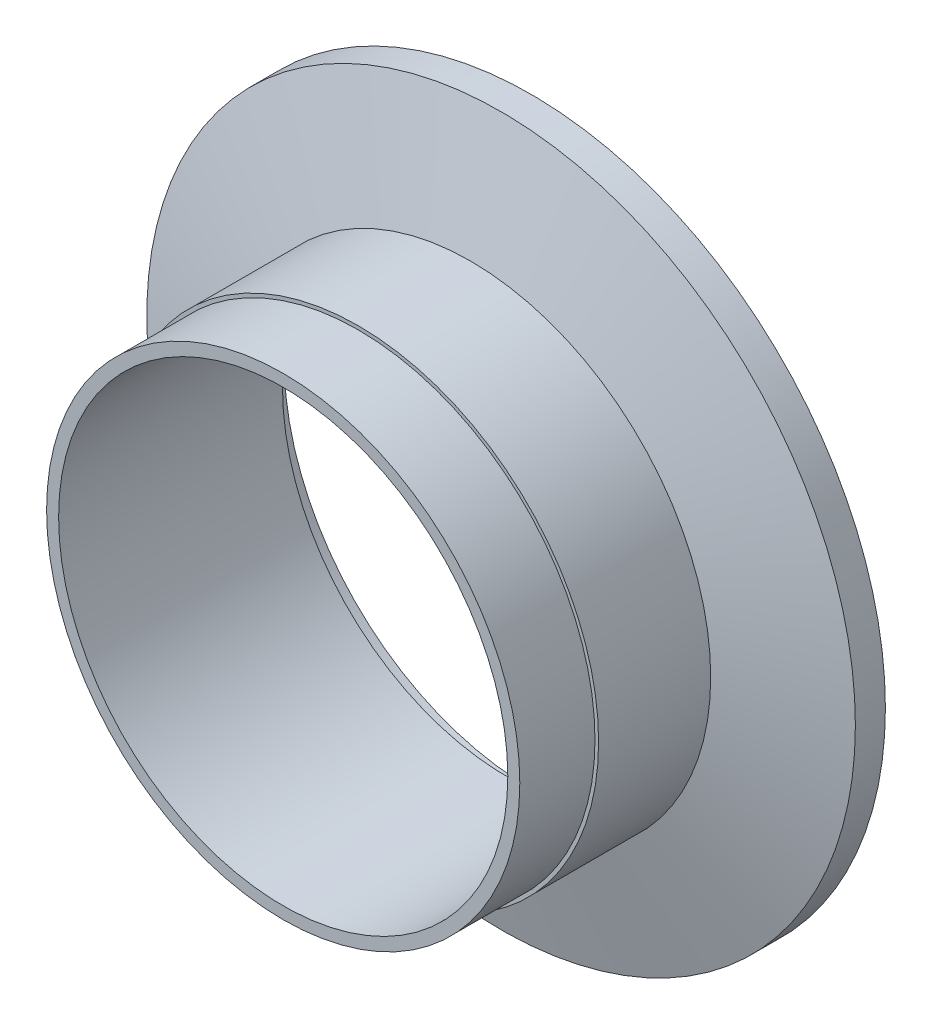
ISO-10303-21;
HEADER;
FILE_DESCRIPTION(('STEP AP214'),'2;1');
FILE_NAME('part.step','',(''),(''),'','','');
FILE_SCHEMA(('AUTOMOTIVE_DESIGN { 1 0 10303 214 1 1 1 1 }'));
ENDSEC;
DATA;
#1=APPLICATION_CONTEXT('core data for automotive mechanical design processes');
#2=APPLICATION_PROTOCOL_DEFINITION('international standard','automotive_design',2000,#1);
#3=PRODUCT_CONTEXT('',#1,'mechanical');
#4=PRODUCT('Part','Part','',(#3));
#5=PRODUCT_RELATED_PRODUCT_CATEGORY('part','',(#4));
#6=PRODUCT_DEFINITION_FORMATION('','',#4);
#7=PRODUCT_DEFINITION_CONTEXT('part definition',#1,'design');
#8=PRODUCT_DEFINITION('design','',#6,#7);
#9=PRODUCT_DEFINITION_SHAPE('','',#8);
#10=(LENGTH_UNIT() NAMED_UNIT(*) SI_UNIT(.MILLI.,.METRE.));
#11=(NAMED_UNIT(*) PLANE_ANGLE_UNIT() SI_UNIT($,.RADIAN.));
#12=(NAMED_UNIT(*) SI_UNIT($,.STERADIAN.) SOLID_ANGLE_UNIT());
#13=UNCERTAINTY_MEASURE_WITH_UNIT(LENGTH_MEASURE(1.E-05),#10,'distance_accuracy_value','');
#14=(GEOMETRIC_REPRESENTATION_CONTEXT(3) GLOBAL_UNCERTAINTY_ASSIGNED_CONTEXT((#13)) GLOBAL_UNIT_ASSIGNED_CONTEXT((#10,
#11,#12)) REPRESENTATION_CONTEXT('',''));
#15=CARTESIAN_POINT('',(0.,0.,0.));
#16=DIRECTION('',(0.,0.,1.));
#17=DIRECTION('',(1.,0.,0.));
#18=AXIS2_PLACEMENT_3D('',#15,#16,#17);
#19=CARTESIAN_POINT('',(0.,26.1112,2.54));
#20=DIRECTION('',(0.,0.,1.));
#21=DIRECTION('',(1.,0.,0.));
#22=AXIS2_PLACEMENT_3D('',#19,#20,#21);
#23=PLANE('',#22);
#24=CARTESIAN_POINT('',(0.,0.,2.54));
#25=DIRECTION('',(0.,0.,1.));
#26=DIRECTION('',(1.,0.,0.));
#27=AXIS2_PLACEMENT_3D('',#24,#25,#26);
#28=CIRCLE('',#27,26.1112);
#29=CARTESIAN_POINT('',(26.1112,0.,2.54));
#30=VERTEX_POINT('',#29);
#31=EDGE_CURVE('E53',#30,#30,#28,.T.);
#32=ORIENTED_EDGE('',*,*,#31,.F.);
#33=EDGE_LOOP('',(#32));
#34=FACE_BOUND('',#33,.T.);
#35=CARTESIAN_POINT('',(0.,0.,2.54));
#36=DIRECTION('',(0.,0.,1.));
#37=DIRECTION('',(1.,0.,0.));
#38=AXIS2_PLACEMENT_3D('',#35,#36,#37);
#39=CIRCLE('',#38,23.749);
#40=CARTESIAN_POINT('',(23.749,0.,2.54));
#41=VERTEX_POINT('',#40);
#42=EDGE_CURVE('E10',#41,#41,#39,.T.);
#43=ORIENTED_EDGE('',*,*,#42,.T.);
#44=EDGE_LOOP('',(#43));
#45=FACE_BOUND('',#44,.T.);
#46=ADVANCED_FACE('F32',(#34,#45),#23,.F.);
#47=CARTESIAN_POINT('',(0.,0.,56.0408602849554));
#48=DIRECTION('',(0.,0.,1.));
#49=DIRECTION('',(1.,0.,0.));
#50=AXIS2_PLACEMENT_3D('',#47,#48,#49);
#51=CYLINDRICAL_SURFACE('',#50,23.749);
#52=ORIENTED_EDGE('',*,*,#42,.F.);
#53=EDGE_LOOP('',(#52));
#54=FACE_BOUND('',#53,.T.);
#55=CARTESIAN_POINT('',(0.,0.,26.2128));
#56=DIRECTION('',(0.,0.,1.));
#57=DIRECTION('',(1.,0.,0.));
#58=AXIS2_PLACEMENT_3D('',#55,#56,#57);
#59=CIRCLE('',#58,23.749);
#60=CARTESIAN_POINT('',(23.749,0.,26.2128));
#61=VERTEX_POINT('',#60);
#62=EDGE_CURVE('E39',#61,#61,#59,.T.);
#63=ORIENTED_EDGE('',*,*,#62,.T.);
#64=EDGE_LOOP('',(#63));
#65=FACE_BOUND('',#64,.T.);
#66=ADVANCED_FACE('F100',(#54,#65),#51,.F.);
#67=CARTESIAN_POINT('',(0.,23.749,26.2128));
#68=DIRECTION('',(0.,0.,-1.));
#69=DIRECTION('',(-1.,0.,0.));
#70=AXIS2_PLACEMENT_3D('',#67,#68,#69);
#71=PLANE('',#70);
#72=CARTESIAN_POINT('',(0.,0.,26.2128));
#73=DIRECTION('',(0.,0.,-1.));
#74=DIRECTION('',(-1.,0.,0.));
#75=AXIS2_PLACEMENT_3D('',#72,#73,#74);
#76=CIRCLE('',#75,25.019);
#77=CARTESIAN_POINT('',(-25.019,0.,26.2128));
#78=VERTEX_POINT('',#77);
#79=EDGE_CURVE('E35',#78,#78,#76,.F.);
#80=ORIENTED_EDGE('',*,*,#79,.T.);
#81=EDGE_LOOP('',(#80));
#82=FACE_BOUND('',#81,.T.);
#83=ORIENTED_EDGE('',*,*,#62,.F.);
#84=EDGE_LOOP('',(#83));
#85=FACE_BOUND('',#84,.T.);
#86=ADVANCED_FACE('F104',(#82,#85),#71,.F.);
#87=CARTESIAN_POINT('',(0.,0.,56.0408602849554));
#88=DIRECTION('',(0.,0.,1.));
#89=DIRECTION('',(1.,0.,0.));
#90=AXIS2_PLACEMENT_3D('',#87,#88,#89);
#91=CYLINDRICAL_SURFACE('',#90,25.4);
#92=CARTESIAN_POINT('',(0.,0.,18.2626));
#93=DIRECTION('',(0.,0.,-1.));
#94=DIRECTION('',(-1.,0.,0.));
#95=AXIS2_PLACEMENT_3D('',#92,#93,#94);
#96=CIRCLE('',#95,25.4);
#97=CARTESIAN_POINT('',(-25.4,0.,18.2626));
#98=VERTEX_POINT('',#97);
#99=EDGE_CURVE('E47',#98,#98,#96,.T.);
#100=ORIENTED_EDGE('',*,*,#99,.T.);
#101=EDGE_LOOP('',(#100));
#102=FACE_BOUND('',#101,.T.);
#103=CARTESIAN_POINT('',(0.,0.,6.4078070066815));
#104=DIRECTION('',(0.,0.,1.));
#105=DIRECTION('',(1.,0.,0.));
#106=AXIS2_PLACEMENT_3D('',#103,#104,#105);
#107=CIRCLE('',#106,25.4);
#108=CARTESIAN_POINT('',(25.4,0.,6.4078070066815));
#109=VERTEX_POINT('',#108);
#110=EDGE_CURVE('E44',#109,#109,#107,.T.);
#111=ORIENTED_EDGE('',*,*,#110,.T.);
#112=EDGE_LOOP('',(#111));
#113=FACE_BOUND('',#112,.T.);
#114=ADVANCED_FACE('F72',(#102,#113),#91,.T.);
#115=CARTESIAN_POINT('',(0.,0.,3.175));
#116=DIRECTION('',(0.,0.,-1.));
#117=DIRECTION('',(-1.,0.,0.));
#118=AXIS2_PLACEMENT_3D('',#115,#116,#117);
#119=CONICAL_SURFACE('',#118,37.465,1.30899693899575);
#120=ORIENTED_EDGE('',*,*,#110,.F.);
#121=EDGE_LOOP('',(#120));
#122=FACE_BOUND('',#121,.T.);
#123=CARTESIAN_POINT('',(0.,0.,3.175));
#124=DIRECTION('',(0.,0.,1.));
#125=DIRECTION('',(1.,0.,0.));
#126=AXIS2_PLACEMENT_3D('',#123,#124,#125);
#127=CIRCLE('',#126,37.465);
#128=CARTESIAN_POINT('',(37.465,0.,3.175));
#129=VERTEX_POINT('',#128);
#130=EDGE_CURVE('E67',#129,#129,#127,.T.);
#131=ORIENTED_EDGE('',*,*,#130,.T.);
#132=EDGE_LOOP('',(#131));
#133=FACE_BOUND('',#132,.T.);
#134=ADVANCED_FACE('F74',(#122,#133),#119,.T.);
#135=CARTESIAN_POINT('',(0.,0.,56.0408602849554));
#136=DIRECTION('',(0.,0.,1.));
#137=DIRECTION('',(1.,0.,0.));
#138=AXIS2_PLACEMENT_3D('',#135,#136,#137);
#139=CYLINDRICAL_SURFACE('',#138,37.465);
#140=ORIENTED_EDGE('',*,*,#130,.F.);
#141=EDGE_LOOP('',(#140));
#142=FACE_BOUND('',#141,.T.);
#143=CARTESIAN_POINT('',(0.,0.,0.));
#144=DIRECTION('',(0.,0.,1.));
#145=DIRECTION('',(1.,0.,0.));
#146=AXIS2_PLACEMENT_3D('',#143,#144,#145);
#147=CIRCLE('',#146,37.465);
#148=CARTESIAN_POINT('',(37.465,0.,0.));
#149=VERTEX_POINT('',#148);
#150=EDGE_CURVE('E64',#149,#149,#147,.T.);
#151=ORIENTED_EDGE('',*,*,#150,.T.);
#152=EDGE_LOOP('',(#151));
#153=FACE_BOUND('',#152,.T.);
#154=ADVANCED_FACE('F77',(#142,#153),#139,.T.);
#155=CARTESIAN_POINT('',(0.,37.465,0.));
#156=DIRECTION('',(0.,0.,1.));
#157=DIRECTION('',(1.,0.,0.));
#158=AXIS2_PLACEMENT_3D('',#155,#156,#157);
#159=PLANE('',#158);
#160=ORIENTED_EDGE('',*,*,#150,.F.);
#161=EDGE_LOOP('',(#160));
#162=FACE_BOUND('',#161,.T.);
#163=CARTESIAN_POINT('',(0.,0.,0.));
#164=DIRECTION('',(0.,0.,1.));
#165=DIRECTION('',(1.,0.,0.));
#166=AXIS2_PLACEMENT_3D('',#163,#164,#165);
#167=CIRCLE('',#166,26.1112);
#168=CARTESIAN_POINT('',(26.1112,0.,0.));
#169=VERTEX_POINT('',#168);
#170=EDGE_CURVE('E61',#169,#169,#167,.T.);
#171=ORIENTED_EDGE('',*,*,#170,.T.);
#172=EDGE_LOOP('',(#171));
#173=FACE_BOUND('',#172,.T.);
#174=ADVANCED_FACE('F83',(#162,#173),#159,.F.);
#175=CARTESIAN_POINT('',(0.,0.,56.0408602849554));
#176=DIRECTION('',(0.,0.,1.));
#177=DIRECTION('',(1.,0.,0.));
#178=AXIS2_PLACEMENT_3D('',#175,#176,#177);
#179=CYLINDRICAL_SURFACE('',#178,26.1112);
#180=ORIENTED_EDGE('',*,*,#170,.F.);
#181=EDGE_LOOP('',(#180));
#182=FACE_BOUND('',#181,.T.);
#183=ORIENTED_EDGE('',*,*,#31,.T.);
#184=EDGE_LOOP('',(#183));
#185=FACE_BOUND('',#184,.T.);
#186=ADVANCED_FACE('F89',(#182,#185),#179,.F.);
#187=CARTESIAN_POINT('',(0.,0.,38.126599349436));
#188=DIRECTION('',(0.,0.,-1.));
#189=DIRECTION('',(-1.,0.,0.));
#190=AXIS2_PLACEMENT_3D('',#187,#188,#189);
#191=CYLINDRICAL_SURFACE('',#190,25.019);
#192=CARTESIAN_POINT('',(0.,0.,18.2626));
#193=DIRECTION('',(0.,0.,-1.));
#194=DIRECTION('',(-1.,0.,0.));
#195=AXIS2_PLACEMENT_3D('',#192,#193,#194);
#196=CIRCLE('',#195,25.019);
#197=CARTESIAN_POINT('',(-25.019,0.,18.2626));
#198=VERTEX_POINT('',#197);
#199=EDGE_CURVE('E49',#198,#198,#196,.T.);
#200=ORIENTED_EDGE('',*,*,#199,.F.);
#201=EDGE_LOOP('',(#200));
#202=FACE_BOUND('',#201,.T.);
#203=ORIENTED_EDGE('',*,*,#79,.F.);
#204=EDGE_LOOP('',(#203));
#205=FACE_BOUND('',#204,.T.);
#206=ADVANCED_FACE('F95',(#202,#205),#191,.T.);
#207=CARTESIAN_POINT('',(0.,37.1389694064558,18.2626));
#208=DIRECTION('',(0.,0.,-1.));
#209=DIRECTION('',(-1.,0.,0.));
#210=AXIS2_PLACEMENT_3D('',#207,#208,#209);
#211=PLANE('',#210);
#212=ORIENTED_EDGE('',*,*,#199,.T.);
#213=EDGE_LOOP('',(#212));
#214=FACE_BOUND('',#213,.T.);
#215=ORIENTED_EDGE('',*,*,#99,.F.);
#216=EDGE_LOOP('',(#215));
#217=FACE_BOUND('',#216,.T.);
#218=ADVANCED_FACE('F117',(#214,#217),#211,.F.);
#219=CLOSED_SHELL('',(#46,#66,#86,#114,#134,#154,#174,#186,#206,#218));
#220=MANIFOLD_SOLID_BREP('B2',#219);
#221=ADVANCED_BREP_SHAPE_REPRESENTATION('',(#18,#220),#14);
#222=SHAPE_DEFINITION_REPRESENTATION(#9,#221);
ENDSEC;
END-ISO-10303-21;
